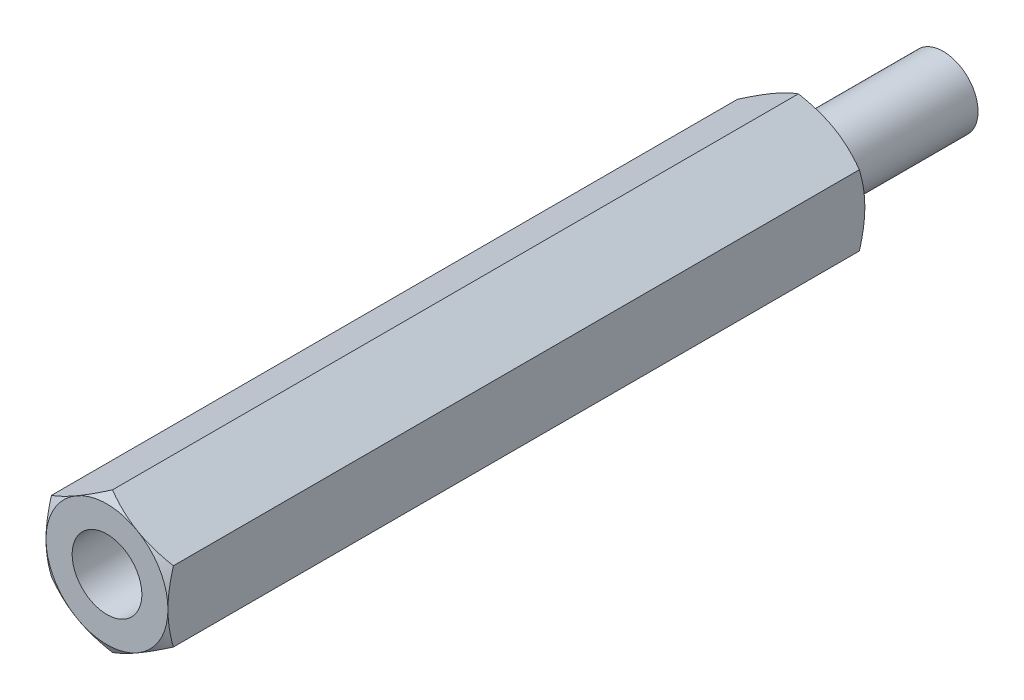
ISO-10303-21;
HEADER;
FILE_DESCRIPTION(('STEP AP214'),'2;1');
FILE_NAME('part.step','',(''),(''),'','','');
FILE_SCHEMA(('AUTOMOTIVE_DESIGN { 1 0 10303 214 1 1 1 1 }'));
ENDSEC;
DATA;
#1=APPLICATION_CONTEXT('core data for automotive mechanical design processes');
#2=APPLICATION_PROTOCOL_DEFINITION('international standard','automotive_design',2000,#1);
#3=PRODUCT_CONTEXT('',#1,'mechanical');
#4=PRODUCT('Part','Part','',(#3));
#5=PRODUCT_RELATED_PRODUCT_CATEGORY('part','',(#4));
#6=PRODUCT_DEFINITION_FORMATION('','',#4);
#7=PRODUCT_DEFINITION_CONTEXT('part definition',#1,'design');
#8=PRODUCT_DEFINITION('design','',#6,#7);
#9=PRODUCT_DEFINITION_SHAPE('','',#8);
#10=(LENGTH_UNIT() NAMED_UNIT(*) SI_UNIT(.MILLI.,.METRE.));
#11=(NAMED_UNIT(*) PLANE_ANGLE_UNIT() SI_UNIT($,.RADIAN.));
#12=(NAMED_UNIT(*) SI_UNIT($,.STERADIAN.) SOLID_ANGLE_UNIT());
#13=UNCERTAINTY_MEASURE_WITH_UNIT(LENGTH_MEASURE(1.E-05),#10,'distance_accuracy_value','');
#14=(GEOMETRIC_REPRESENTATION_CONTEXT(3) GLOBAL_UNCERTAINTY_ASSIGNED_CONTEXT((#13)) GLOBAL_UNIT_ASSIGNED_CONTEXT((#10,
#11,#12)) REPRESENTATION_CONTEXT('',''));
#15=CARTESIAN_POINT('',(0.,0.,0.));
#16=DIRECTION('',(0.,0.,1.));
#17=DIRECTION('',(1.,0.,0.));
#18=AXIS2_PLACEMENT_3D('',#15,#16,#17);
#19=CARTESIAN_POINT('',(0.,0.,20.));
#20=DIRECTION('',(0.,0.,1.));
#21=DIRECTION('',(1.,0.,0.));
#22=AXIS2_PLACEMENT_3D('',#19,#20,#21);
#23=PLANE('',#22);
#24=CARTESIAN_POINT('',(0.,0.,20.));
#25=DIRECTION('',(0.,0.,-1.));
#26=DIRECTION('',(1.,0.,0.));
#27=AXIS2_PLACEMENT_3D('',#24,#25,#26);
#28=CIRCLE('',#27,2.);
#29=CARTESIAN_POINT('',(-2.,0.,20.));
#30=VERTEX_POINT('',#29);
#31=EDGE_CURVE('P0_E206',#30,#30,#28,.T.);
#32=ORIENTED_EDGE('',*,*,#31,.T.);
#33=EDGE_LOOP('',(#32));
#34=FACE_BOUND('',#33,.T.);
#35=CARTESIAN_POINT('',(0.,0.,20.));
#36=DIRECTION('',(0.,0.,1.));
#37=DIRECTION('',(0.,1.,0.));
#38=AXIS2_PLACEMENT_3D('',#35,#36,#37);
#39=CIRCLE('',#38,3.5);
#40=CARTESIAN_POINT('',(1.75,3.03108891324554,20.));
#41=VERTEX_POINT('',#40);
#42=CARTESIAN_POINT('',(-1.75,3.03108891324553,20.));
#43=VERTEX_POINT('',#42);
#44=EDGE_CURVE('P0_E201',#41,#43,#39,.T.);
#45=ORIENTED_EDGE('',*,*,#44,.T.);
#46=CARTESIAN_POINT('',(0.,0.,20.));
#47=DIRECTION('',(0.,0.,1.));
#48=DIRECTION('',(0.,1.,0.));
#49=AXIS2_PLACEMENT_3D('',#46,#47,#48);
#50=CIRCLE('',#49,3.5);
#51=CARTESIAN_POINT('',(-3.5,0.,20.));
#52=VERTEX_POINT('',#51);
#53=EDGE_CURVE('P0_E210',#43,#52,#50,.T.);
#54=ORIENTED_EDGE('',*,*,#53,.T.);
#55=CARTESIAN_POINT('',(0.,0.,20.));
#56=DIRECTION('',(0.,0.,1.));
#57=DIRECTION('',(0.,1.,0.));
#58=AXIS2_PLACEMENT_3D('',#55,#56,#57);
#59=CIRCLE('',#58,3.5);
#60=CARTESIAN_POINT('',(-1.75,-3.03108891324554,20.));
#61=VERTEX_POINT('',#60);
#62=EDGE_CURVE('P0_E421',#52,#61,#59,.T.);
#63=ORIENTED_EDGE('',*,*,#62,.T.);
#64=CARTESIAN_POINT('',(0.,0.,20.));
#65=DIRECTION('',(0.,0.,1.));
#66=DIRECTION('',(0.,1.,0.));
#67=AXIS2_PLACEMENT_3D('',#64,#65,#66);
#68=CIRCLE('',#67,3.5);
#69=CARTESIAN_POINT('',(1.75,-3.03108891324553,20.));
#70=VERTEX_POINT('',#69);
#71=EDGE_CURVE('P0_E415',#61,#70,#68,.T.);
#72=ORIENTED_EDGE('',*,*,#71,.T.);
#73=CARTESIAN_POINT('',(0.,0.,20.));
#74=DIRECTION('',(0.,0.,1.));
#75=DIRECTION('',(0.,1.,0.));
#76=AXIS2_PLACEMENT_3D('',#73,#74,#75);
#77=CIRCLE('',#76,3.5);
#78=CARTESIAN_POINT('',(3.5,0.,20.));
#79=VERTEX_POINT('',#78);
#80=EDGE_CURVE('P0_E194',#70,#79,#77,.T.);
#81=ORIENTED_EDGE('',*,*,#80,.T.);
#82=CARTESIAN_POINT('',(0.,0.,20.));
#83=DIRECTION('',(0.,0.,1.));
#84=DIRECTION('',(0.,1.,0.));
#85=AXIS2_PLACEMENT_3D('',#82,#83,#84);
#86=CIRCLE('',#85,3.5);
#87=EDGE_CURVE('P0_E203',#79,#41,#86,.T.);
#88=ORIENTED_EDGE('',*,*,#87,.T.);
#89=EDGE_LOOP('',(#45,#54,#63,#72,#81,#88));
#90=FACE_BOUND('',#89,.T.);
#91=ADVANCED_FACE('P0_F17',(#34,#90),#23,.T.);
#92=CARTESIAN_POINT('',(-3.5,-2.02072594216369,0.));
#93=DIRECTION('',(-0.5,-0.866025403784439,0.));
#94=DIRECTION('',(-0.866025403784439,0.5,0.));
#95=AXIS2_PLACEMENT_3D('',#92,#93,#94);
#96=PLANE('',#95);
#97=CARTESIAN_POINT('',(-1.75,-3.03108891324553,-20.));
#98=CARTESIAN_POINT('',(-2.56217782649107,-2.56217782649107,-20.));
#99=CARTESIAN_POINT('',(-3.5,-2.02072594216369,-19.6873926088304));
#100=(BOUNDED_CURVE() B_SPLINE_CURVE(2,(#97,#98,#99),.UNSPECIFIED.,.F.,
.F.) B_SPLINE_CURVE_WITH_KNOTS((3,3),(1.03064785223055,1.34912453668423),
.UNSPECIFIED.) CURVE() GEOMETRIC_REPRESENTATION_ITEM() RATIONAL_B_SPLINE_CURVE((1.,
1.12214587875236,1.16880406420474)) REPRESENTATION_ITEM(''));
#101=CARTESIAN_POINT('',(-1.75,-3.03108891324554,-20.));
#102=VERTEX_POINT('',#101);
#103=CARTESIAN_POINT('',(-3.5,-2.02072594216369,-19.6873926088304));
#104=VERTEX_POINT('',#103);
#105=EDGE_CURVE('P0_E319',#102,#104,#100,.T.);
#106=ORIENTED_EDGE('',*,*,#105,.F.);
#107=CARTESIAN_POINT('',(0.,-4.04145188432738,-19.6873926088304));
#108=CARTESIAN_POINT('',(-0.93782217350893,-3.5,-20.));
#109=CARTESIAN_POINT('',(-1.75,-3.03108891324553,-20.));
#110=(BOUNDED_CURVE() B_SPLINE_CURVE(2,(#107,#108,#109),.UNSPECIFIED.,.F.,
.F.) B_SPLINE_CURVE_WITH_KNOTS((3,3),(0.738158892315948,1.06042130599399),
.UNSPECIFIED.) CURVE() GEOMETRIC_REPRESENTATION_ITEM() RATIONAL_B_SPLINE_CURVE((1.17255857963455,
1.12394675203494,1.)) REPRESENTATION_ITEM(''));
#111=CARTESIAN_POINT('',(0.,-4.04145188432738,-19.6873926088304));
#112=VERTEX_POINT('',#111);
#113=EDGE_CURVE('P0_E327',#112,#102,#110,.T.);
#114=ORIENTED_EDGE('',*,*,#113,.F.);
#115=DIRECTION('',(0.,0.,1.));
#116=VECTOR('',#115,1.);
#117=CARTESIAN_POINT('',(0.,-4.04145188432738,0.));
#118=LINE('',#117,#116);
#119=CARTESIAN_POINT('',(0.,-4.04145188432738,19.6873926088304));
#120=VERTEX_POINT('',#119);
#121=EDGE_CURVE('P0_E365',#112,#120,#118,.T.);
#122=ORIENTED_EDGE('',*,*,#121,.T.);
#123=CARTESIAN_POINT('',(0.,-4.04145188432738,19.6873926088304));
#124=CARTESIAN_POINT('',(-0.937822173506976,-3.50000000000113,19.9999999999989));
#125=CARTESIAN_POINT('',(-1.75,-3.03108891324553,20.));
#126=(BOUNDED_CURVE() B_SPLINE_CURVE(2,(#123,#124,#125),.UNSPECIFIED.,.F.,
.F.) B_SPLINE_CURVE_WITH_KNOTS((3,3),(0.921914113497757,1.27000474298252),
.UNSPECIFIED.) CURVE() GEOMETRIC_REPRESENTATION_ITEM() RATIONAL_B_SPLINE_CURVE((1.19657732070712,
1.13539988487303,1.)) REPRESENTATION_ITEM(''));
#127=EDGE_CURVE('P0_E199',#120,#61,#126,.T.);
#128=ORIENTED_EDGE('',*,*,#127,.T.);
#129=CARTESIAN_POINT('',(-1.75,-3.03108891324553,20.));
#130=CARTESIAN_POINT('',(-2.56217782649303,-2.56217782648994,19.9999999999989));
#131=CARTESIAN_POINT('',(-3.5,-2.02072594216369,19.6873926088304));
#132=(BOUNDED_CURVE() B_SPLINE_CURVE(2,(#129,#130,#131),.UNSPECIFIED.,.F.,
.F.) B_SPLINE_CURVE_WITH_KNOTS((3,3),(1.27000474298252,1.61809537246729),
.UNSPECIFIED.) CURVE() GEOMETRIC_REPRESENTATION_ITEM() RATIONAL_B_SPLINE_CURVE((1.,
1.13539988487303,1.19657732070712)) REPRESENTATION_ITEM(''));
#133=CARTESIAN_POINT('',(-3.5,-2.02072594216369,19.6873926088304));
#134=VERTEX_POINT('',#133);
#135=EDGE_CURVE('P0_E416',#61,#134,#132,.T.);
#136=ORIENTED_EDGE('',*,*,#135,.T.);
#137=DIRECTION('',(0.,0.,1.));
#138=VECTOR('',#137,1.);
#139=CARTESIAN_POINT('',(-3.5,-2.02072594216369,0.));
#140=LINE('',#139,#138);
#141=EDGE_CURVE('P0_E213',#104,#134,#140,.T.);
#142=ORIENTED_EDGE('',*,*,#141,.F.);
#143=EDGE_LOOP('',(#106,#114,#122,#128,#136,#142));
#144=FACE_BOUND('',#143,.T.);
#145=ADVANCED_FACE('P0_F448',(#144),#96,.T.);
#146=CARTESIAN_POINT('',(0.,0.,10.));
#147=DIRECTION('',(0.,0.,1.));
#148=DIRECTION('',(1.,0.,0.));
#149=AXIS2_PLACEMENT_3D('',#146,#147,#148);
#150=PLANE('',#149);
#151=CARTESIAN_POINT('',(0.,0.,10.));
#152=DIRECTION('',(0.,0.,-1.));
#153=DIRECTION('',(1.,0.,0.));
#154=AXIS2_PLACEMENT_3D('',#151,#152,#153);
#155=CIRCLE('',#154,2.);
#156=CARTESIAN_POINT('',(-2.,0.,10.));
#157=VERTEX_POINT('',#156);
#158=EDGE_CURVE('P0_E11',#157,#157,#155,.T.);
#159=ORIENTED_EDGE('',*,*,#158,.F.);
#160=EDGE_LOOP('',(#159));
#161=FACE_BOUND('',#160,.T.);
#162=ADVANCED_FACE('P0_F438',(#161),#150,.T.);
#163=CARTESIAN_POINT('',(0.,0.,20.));
#164=DIRECTION('',(0.,0.,-1.));
#165=DIRECTION('',(1.,0.,0.));
#166=AXIS2_PLACEMENT_3D('',#163,#164,#165);
#167=CYLINDRICAL_SURFACE('',#166,2.);
#168=ORIENTED_EDGE('',*,*,#31,.F.);
#169=DIRECTION('',(0.,0.,-1.));
#170=VECTOR('',#169,1.);
#171=CARTESIAN_POINT('',(-2.,0.,20.));
#172=LINE('',#171,#170);
#173=EDGE_CURVE('P0_E20',#30,#157,#172,.T.);
#174=ORIENTED_EDGE('',*,*,#173,.T.);
#175=ORIENTED_EDGE('',*,*,#158,.T.);
#176=ORIENTED_EDGE('',*,*,#173,.F.);
#177=EDGE_LOOP('',(#168,#174,#175,#176));
#178=FACE_BOUND('',#177,.T.);
#179=ADVANCED_FACE('P0_F436',(#178),#167,.F.);
#180=CARTESIAN_POINT('',(0.,0.,17.5103629710818));
#181=DIRECTION('',(0.,0.,-1.));
#182=DIRECTION('',(0.,1.,0.));
#183=AXIS2_PLACEMENT_3D('',#180,#181,#182);
#184=CONICAL_SURFACE('',#183,7.81217782649107,1.0471975511966);
#185=CARTESIAN_POINT('',(-1.75,3.03108891324554,20.));
#186=CARTESIAN_POINT('',(-0.937822173506975,3.50000000000113,19.9999999999989));
#187=CARTESIAN_POINT('',(0.,4.04145188432738,19.6873926088304));
#188=(BOUNDED_CURVE() B_SPLINE_CURVE(2,(#185,#186,#187),.UNSPECIFIED.,.F.,
.F.) B_SPLINE_CURVE_WITH_KNOTS((3,3),(1.27000474298252,1.61809537246729),
.UNSPECIFIED.) CURVE() GEOMETRIC_REPRESENTATION_ITEM() RATIONAL_B_SPLINE_CURVE((1.,
1.13539988487303,1.19657732070712)) REPRESENTATION_ITEM(''));
#189=CARTESIAN_POINT('',(0.,4.04145188432738,19.6873926088304));
#190=VERTEX_POINT('',#189);
#191=EDGE_CURVE('P0_E238',#43,#190,#188,.T.);
#192=ORIENTED_EDGE('',*,*,#191,.F.);
#193=ORIENTED_EDGE('',*,*,#44,.F.);
#194=CARTESIAN_POINT('',(0.,4.04145188432738,19.6873926088304));
#195=CARTESIAN_POINT('',(0.937822173506976,3.50000000000113,19.9999999999989));
#196=CARTESIAN_POINT('',(1.75,3.03108891324553,20.));
#197=(BOUNDED_CURVE() B_SPLINE_CURVE(2,(#194,#195,#196),.UNSPECIFIED.,.F.,
.F.) B_SPLINE_CURVE_WITH_KNOTS((3,3),(0.921914113497757,1.27000474298252),
.UNSPECIFIED.) CURVE() GEOMETRIC_REPRESENTATION_ITEM() RATIONAL_B_SPLINE_CURVE((1.19657732070712,
1.13539988487303,1.)) REPRESENTATION_ITEM(''));
#198=EDGE_CURVE('P0_E287',#190,#41,#197,.T.);
#199=ORIENTED_EDGE('',*,*,#198,.F.);
#200=EDGE_LOOP('',(#192,#193,#199));
#201=FACE_BOUND('',#200,.T.);
#202=ADVANCED_FACE('P0_F437',(#201),#184,.T.);
#203=CARTESIAN_POINT('',(0.,0.,17.5103629710818));
#204=DIRECTION('',(0.,0.,-1.));
#205=DIRECTION('',(0.,1.,0.));
#206=AXIS2_PLACEMENT_3D('',#203,#204,#205);
#207=CONICAL_SURFACE('',#206,7.81217782649107,1.0471975511966);
#208=CARTESIAN_POINT('',(-3.5,0.,20.));
#209=CARTESIAN_POINT('',(-3.5,0.937822173511186,19.9999999999989));
#210=CARTESIAN_POINT('',(-3.5,2.02072594216369,19.6873926088304));
#211=(BOUNDED_CURVE() B_SPLINE_CURVE(2,(#208,#209,#210),.UNSPECIFIED.,.F.,
.F.) B_SPLINE_CURVE_WITH_KNOTS((3,3),(1.27000474298252,1.61809537246729),
.UNSPECIFIED.) CURVE() GEOMETRIC_REPRESENTATION_ITEM() RATIONAL_B_SPLINE_CURVE((1.,
1.13539988487303,1.19657732070712)) REPRESENTATION_ITEM(''));
#212=CARTESIAN_POINT('',(-3.5,2.02072594216369,19.6873926088304));
#213=VERTEX_POINT('',#212);
#214=EDGE_CURVE('P0_E281',#52,#213,#211,.T.);
#215=ORIENTED_EDGE('',*,*,#214,.F.);
#216=ORIENTED_EDGE('',*,*,#53,.F.);
#217=CARTESIAN_POINT('',(-3.5,2.02072594216369,19.6873926088304));
#218=CARTESIAN_POINT('',(-2.56217782649303,2.56217782648994,19.9999999999989));
#219=CARTESIAN_POINT('',(-1.75,3.03108891324554,20.));
#220=(BOUNDED_CURVE() B_SPLINE_CURVE(2,(#217,#218,#219),.UNSPECIFIED.,.F.,
.F.) B_SPLINE_CURVE_WITH_KNOTS((3,3),(0.921914113497758,1.27000474298252),
.UNSPECIFIED.) CURVE() GEOMETRIC_REPRESENTATION_ITEM() RATIONAL_B_SPLINE_CURVE((1.19657732070712,
1.13539988487303,1.)) REPRESENTATION_ITEM(''));
#221=EDGE_CURVE('P0_E207',#213,#43,#220,.T.);
#222=ORIENTED_EDGE('',*,*,#221,.F.);
#223=EDGE_LOOP('',(#215,#216,#222));
#224=FACE_BOUND('',#223,.T.);
#225=ADVANCED_FACE('P0_F446',(#224),#207,.T.);
#226=CARTESIAN_POINT('',(0.,0.,17.5103629710818));
#227=DIRECTION('',(0.,0.,-1.));
#228=DIRECTION('',(0.,1.,0.));
#229=AXIS2_PLACEMENT_3D('',#226,#227,#228);
#230=CONICAL_SURFACE('',#229,7.81217782649107,1.0471975511966);
#231=ORIENTED_EDGE('',*,*,#135,.F.);
#232=ORIENTED_EDGE('',*,*,#62,.F.);
#233=CARTESIAN_POINT('',(-3.5,-2.02072594216369,19.6873926088304));
#234=CARTESIAN_POINT('',(-3.5,-0.937822173511202,19.9999999999989));
#235=CARTESIAN_POINT('',(-3.5,0.,20.));
#236=(BOUNDED_CURVE() B_SPLINE_CURVE(2,(#233,#234,#235),.UNSPECIFIED.,.F.,
.F.) B_SPLINE_CURVE_WITH_KNOTS((3,3),(0.921914113497763,1.27000474298252),
.UNSPECIFIED.) CURVE() GEOMETRIC_REPRESENTATION_ITEM() RATIONAL_B_SPLINE_CURVE((1.19657732070712,
1.13539988487303,1.)) REPRESENTATION_ITEM(''));
#237=EDGE_CURVE('P0_E218',#134,#52,#236,.T.);
#238=ORIENTED_EDGE('',*,*,#237,.F.);
#239=EDGE_LOOP('',(#231,#232,#238));
#240=FACE_BOUND('',#239,.T.);
#241=ADVANCED_FACE('P0_F471',(#240),#230,.T.);
#242=CARTESIAN_POINT('',(0.,0.,17.5103629710818));
#243=DIRECTION('',(0.,0.,-1.));
#244=DIRECTION('',(0.,-1.,0.));
#245=AXIS2_PLACEMENT_3D('',#242,#243,#244);
#246=CONICAL_SURFACE('',#245,7.81217782649107,1.0471975511966);
#247=ORIENTED_EDGE('',*,*,#127,.F.);
#248=CARTESIAN_POINT('',(1.75,-3.03108891324554,20.));
#249=CARTESIAN_POINT('',(0.937822173506975,-3.50000000000113,19.9999999999989));
#250=CARTESIAN_POINT('',(0.,-4.04145188432738,19.6873926088304));
#251=(BOUNDED_CURVE() B_SPLINE_CURVE(2,(#248,#249,#250),.UNSPECIFIED.,.F.,
.F.) B_SPLINE_CURVE_WITH_KNOTS((3,3),(1.27000474298252,1.61809537246729),
.UNSPECIFIED.) CURVE() GEOMETRIC_REPRESENTATION_ITEM() RATIONAL_B_SPLINE_CURVE((1.,
1.13539988487303,1.19657732070712)) REPRESENTATION_ITEM(''));
#252=EDGE_CURVE('P0_E229',#70,#120,#251,.T.);
#253=ORIENTED_EDGE('',*,*,#252,.F.);
#254=ORIENTED_EDGE('',*,*,#71,.F.);
#255=EDGE_LOOP('',(#247,#253,#254));
#256=FACE_BOUND('',#255,.T.);
#257=ADVANCED_FACE('P0_F483',(#256),#246,.T.);
#258=CARTESIAN_POINT('',(0.,0.,17.5103629710818));
#259=DIRECTION('',(0.,0.,-1.));
#260=DIRECTION('',(0.,1.,0.));
#261=AXIS2_PLACEMENT_3D('',#258,#259,#260);
#262=CONICAL_SURFACE('',#261,7.81217782649107,1.0471975511966);
#263=CARTESIAN_POINT('',(3.5,-2.02072594216369,19.6873926088304));
#264=CARTESIAN_POINT('',(2.56217782649303,-2.56217782648994,19.9999999999989));
#265=CARTESIAN_POINT('',(1.75,-3.03108891324554,20.));
#266=(BOUNDED_CURVE() B_SPLINE_CURVE(2,(#263,#264,#265),.UNSPECIFIED.,.F.,
.F.) B_SPLINE_CURVE_WITH_KNOTS((3,3),(0.921914113497758,1.27000474298252),
.UNSPECIFIED.) CURVE() GEOMETRIC_REPRESENTATION_ITEM() RATIONAL_B_SPLINE_CURVE((1.19657732070712,
1.13539988487303,1.)) REPRESENTATION_ITEM(''));
#267=CARTESIAN_POINT('',(3.5,-2.02072594216369,19.6873926088304));
#268=VERTEX_POINT('',#267);
#269=EDGE_CURVE('P0_E225',#268,#70,#266,.T.);
#270=ORIENTED_EDGE('',*,*,#269,.F.);
#271=CARTESIAN_POINT('',(3.5,0.,20.));
#272=CARTESIAN_POINT('',(3.5,-0.937822173511186,19.9999999999989));
#273=CARTESIAN_POINT('',(3.5,-2.02072594216369,19.6873926088304));
#274=(BOUNDED_CURVE() B_SPLINE_CURVE(2,(#271,#272,#273),.UNSPECIFIED.,.F.,
.F.) B_SPLINE_CURVE_WITH_KNOTS((3,3),(1.27000474298252,1.61809537246729),
.UNSPECIFIED.) CURVE() GEOMETRIC_REPRESENTATION_ITEM() RATIONAL_B_SPLINE_CURVE((1.,
1.13539988487303,1.19657732070712)) REPRESENTATION_ITEM(''));
#275=EDGE_CURVE('P0_E394',#79,#268,#274,.T.);
#276=ORIENTED_EDGE('',*,*,#275,.F.);
#277=ORIENTED_EDGE('',*,*,#80,.F.);
#278=EDGE_LOOP('',(#270,#276,#277));
#279=FACE_BOUND('',#278,.T.);
#280=ADVANCED_FACE('P0_F481',(#279),#262,.T.);
#281=CARTESIAN_POINT('',(0.,0.,17.5103629710818));
#282=DIRECTION('',(0.,0.,-1.));
#283=DIRECTION('',(0.,1.,0.));
#284=AXIS2_PLACEMENT_3D('',#281,#282,#283);
#285=CONICAL_SURFACE('',#284,7.81217782649107,1.0471975511966);
#286=CARTESIAN_POINT('',(3.5,2.02072594216369,19.6873926088304));
#287=CARTESIAN_POINT('',(3.5,0.937822173511202,19.9999999999989));
#288=CARTESIAN_POINT('',(3.5,0.,20.));
#289=(BOUNDED_CURVE() B_SPLINE_CURVE(2,(#286,#287,#288),.UNSPECIFIED.,.F.,
.F.) B_SPLINE_CURVE_WITH_KNOTS((3,3),(0.921914113497763,1.27000474298252),
.UNSPECIFIED.) CURVE() GEOMETRIC_REPRESENTATION_ITEM() RATIONAL_B_SPLINE_CURVE((1.19657732070712,
1.13539988487303,1.)) REPRESENTATION_ITEM(''));
#290=CARTESIAN_POINT('',(3.5,2.02072594216369,19.6873926088304));
#291=VERTEX_POINT('',#290);
#292=EDGE_CURVE('P0_E383',#291,#79,#289,.T.);
#293=ORIENTED_EDGE('',*,*,#292,.F.);
#294=CARTESIAN_POINT('',(1.75,3.03108891324553,20.));
#295=CARTESIAN_POINT('',(2.56217782649303,2.56217782648994,19.9999999999989));
#296=CARTESIAN_POINT('',(3.5,2.02072594216369,19.6873926088304));
#297=(BOUNDED_CURVE() B_SPLINE_CURVE(2,(#294,#295,#296),.UNSPECIFIED.,.F.,
.F.) B_SPLINE_CURVE_WITH_KNOTS((3,3),(1.27000474298252,1.61809537246729),
.UNSPECIFIED.) CURVE() GEOMETRIC_REPRESENTATION_ITEM() RATIONAL_B_SPLINE_CURVE((1.,
1.13539988487303,1.19657732070712)) REPRESENTATION_ITEM(''));
#298=EDGE_CURVE('P0_E297',#41,#291,#297,.T.);
#299=ORIENTED_EDGE('',*,*,#298,.F.);
#300=ORIENTED_EDGE('',*,*,#87,.F.);
#301=EDGE_LOOP('',(#293,#299,#300));
#302=FACE_BOUND('',#301,.T.);
#303=ADVANCED_FACE('P0_F492',(#302),#285,.T.);
#304=CARTESIAN_POINT('',(0.,0.,-17.5103629710818));
#305=DIRECTION('',(0.,0.,1.));
#306=DIRECTION('',(0.,1.,0.));
#307=AXIS2_PLACEMENT_3D('',#304,#305,#306);
#308=CONICAL_SURFACE('',#307,7.81217782649107,1.0471975511966);
#309=CARTESIAN_POINT('',(3.5,2.02072594216369,-19.6873926088304));
#310=CARTESIAN_POINT('',(3.5,0.937822173508933,-20.));
#311=CARTESIAN_POINT('',(3.5,0.,-20.));
#312=(BOUNDED_CURVE() B_SPLINE_CURVE(2,(#309,#310,#311),.UNSPECIFIED.,.F.,
.F.) B_SPLINE_CURVE_WITH_KNOTS((3,3),(0.712171167776875,1.03064785223055),
.UNSPECIFIED.) CURVE() GEOMETRIC_REPRESENTATION_ITEM() RATIONAL_B_SPLINE_CURVE((1.16880406420474,
1.12214587875236,1.)) REPRESENTATION_ITEM(''));
#313=CARTESIAN_POINT('',(3.5,2.02072594216369,-19.6873926088304));
#314=VERTEX_POINT('',#313);
#315=CARTESIAN_POINT('',(3.5,0.,-20.));
#316=VERTEX_POINT('',#315);
#317=EDGE_CURVE('P0_E374',#314,#316,#312,.T.);
#318=ORIENTED_EDGE('',*,*,#317,.T.);
#319=CARTESIAN_POINT('',(0.,0.,-20.));
#320=DIRECTION('',(0.,0.,1.));
#321=DIRECTION('',(0.,1.,0.));
#322=AXIS2_PLACEMENT_3D('',#319,#320,#321);
#323=CIRCLE('',#322,3.5);
#324=CARTESIAN_POINT('',(1.75,3.03108891324554,-20.));
#325=VERTEX_POINT('',#324);
#326=EDGE_CURVE('P0_E256',#316,#325,#323,.T.);
#327=ORIENTED_EDGE('',*,*,#326,.T.);
#328=CARTESIAN_POINT('',(1.75,3.03108891324553,-20.));
#329=CARTESIAN_POINT('',(2.56217782649107,2.56217782649107,-20.));
#330=CARTESIAN_POINT('',(3.5,2.02072594216369,-19.6873926088304));
#331=(BOUNDED_CURVE() B_SPLINE_CURVE(2,(#328,#329,#330),.UNSPECIFIED.,.F.,
.F.) B_SPLINE_CURVE_WITH_KNOTS((3,3),(1.03064785223055,1.34912453668423),
.UNSPECIFIED.) CURVE() GEOMETRIC_REPRESENTATION_ITEM() RATIONAL_B_SPLINE_CURVE((1.,
1.12214587875236,1.16880406420474)) REPRESENTATION_ITEM(''));
#332=EDGE_CURVE('P0_E314',#325,#314,#331,.T.);
#333=ORIENTED_EDGE('',*,*,#332,.T.);
#334=EDGE_LOOP('',(#318,#327,#333));
#335=FACE_BOUND('',#334,.T.);
#336=ADVANCED_FACE('P0_F500',(#335),#308,.T.);
#337=CARTESIAN_POINT('',(3.5,-2.02072594216369,0.));
#338=DIRECTION('',(1.,0.,0.));
#339=DIRECTION('',(0.,1.,0.));
#340=AXIS2_PLACEMENT_3D('',#337,#338,#339);
#341=PLANE('',#340);
#342=CARTESIAN_POINT('',(3.5,0.,-20.));
#343=CARTESIAN_POINT('',(3.5,-0.937822173508933,-20.));
#344=CARTESIAN_POINT('',(3.5,-2.02072594216369,-19.6873926088304));
#345=(BOUNDED_CURVE() B_SPLINE_CURVE(2,(#342,#343,#344),.UNSPECIFIED.,.F.,
.F.) B_SPLINE_CURVE_WITH_KNOTS((3,3),(1.03064785223055,1.34912453668423),
.UNSPECIFIED.) CURVE() GEOMETRIC_REPRESENTATION_ITEM() RATIONAL_B_SPLINE_CURVE((1.,
1.12214587875236,1.16880406420474)) REPRESENTATION_ITEM(''));
#346=CARTESIAN_POINT('',(3.5,-2.02072594216369,-19.6873926088304));
#347=VERTEX_POINT('',#346);
#348=EDGE_CURVE('P0_E371',#316,#347,#345,.T.);
#349=ORIENTED_EDGE('',*,*,#348,.F.);
#350=ORIENTED_EDGE('',*,*,#317,.F.);
#351=DIRECTION('',(0.,0.,1.));
#352=VECTOR('',#351,1.);
#353=CARTESIAN_POINT('',(3.5,2.02072594216369,0.));
#354=LINE('',#353,#352);
#355=EDGE_CURVE('P0_E307',#314,#291,#354,.T.);
#356=ORIENTED_EDGE('',*,*,#355,.T.);
#357=ORIENTED_EDGE('',*,*,#292,.T.);
#358=ORIENTED_EDGE('',*,*,#275,.T.);
#359=DIRECTION('',(0.,0.,-1.));
#360=VECTOR('',#359,1.);
#361=CARTESIAN_POINT('',(3.5,-2.02072594216369,0.));
#362=LINE('',#361,#360);
#363=EDGE_CURVE('P0_E228',#268,#347,#362,.T.);
#364=ORIENTED_EDGE('',*,*,#363,.T.);
#365=EDGE_LOOP('',(#349,#350,#356,#357,#358,#364));
#366=FACE_BOUND('',#365,.T.);
#367=ADVANCED_FACE('P0_F489',(#366),#341,.T.);
#368=CARTESIAN_POINT('',(0.,0.,-17.5103629710818));
#369=DIRECTION('',(0.,0.,1.));
#370=DIRECTION('',(0.,1.,0.));
#371=AXIS2_PLACEMENT_3D('',#368,#369,#370);
#372=CONICAL_SURFACE('',#371,7.81217782649107,1.0471975511966);
#373=CARTESIAN_POINT('',(3.5,-2.02072594216369,-19.6873926088304));
#374=CARTESIAN_POINT('',(2.56217782649107,-2.56217782649107,-20.));
#375=CARTESIAN_POINT('',(1.75,-3.03108891324554,-20.));
#376=(BOUNDED_CURVE() B_SPLINE_CURVE(2,(#373,#374,#375),.UNSPECIFIED.,.F.,
.F.) B_SPLINE_CURVE_WITH_KNOTS((3,3),(0.712171167776875,1.03064785223055),
.UNSPECIFIED.) CURVE() GEOMETRIC_REPRESENTATION_ITEM() RATIONAL_B_SPLINE_CURVE((1.16880406420474,
1.12214587875236,1.)) REPRESENTATION_ITEM(''));
#377=CARTESIAN_POINT('',(1.75,-3.03108891324553,-20.));
#378=VERTEX_POINT('',#377);
#379=EDGE_CURVE('P0_E344',#347,#378,#376,.T.);
#380=ORIENTED_EDGE('',*,*,#379,.T.);
#381=CARTESIAN_POINT('',(0.,0.,-20.));
#382=DIRECTION('',(0.,0.,1.));
#383=DIRECTION('',(0.,1.,0.));
#384=AXIS2_PLACEMENT_3D('',#381,#382,#383);
#385=CIRCLE('',#384,3.5);
#386=EDGE_CURVE('P0_E259',#378,#316,#385,.T.);
#387=ORIENTED_EDGE('',*,*,#386,.T.);
#388=ORIENTED_EDGE('',*,*,#348,.T.);
#389=EDGE_LOOP('',(#380,#387,#388));
#390=FACE_BOUND('',#389,.T.);
#391=ADVANCED_FACE('P0_F498',(#390),#372,.T.);
#392=CARTESIAN_POINT('',(0.,-4.04145188432738,0.));
#393=DIRECTION('',(0.5,-0.866025403784439,0.));
#394=DIRECTION('',(0.,0.,-1.));
#395=AXIS2_PLACEMENT_3D('',#392,#393,#394);
#396=PLANE('',#395);
#397=CARTESIAN_POINT('',(1.75,-3.03108891324554,-20.));
#398=CARTESIAN_POINT('',(0.937822173508927,-3.5,-20.));
#399=CARTESIAN_POINT('',(0.,-4.04145188432738,-19.6873926088304));
#400=(BOUNDED_CURVE() B_SPLINE_CURVE(2,(#397,#398,#399),.UNSPECIFIED.,.F.,
.F.) B_SPLINE_CURVE_WITH_KNOTS((3,3),(1.06042130599399,1.38268371967203),
.UNSPECIFIED.) CURVE() GEOMETRIC_REPRESENTATION_ITEM() RATIONAL_B_SPLINE_CURVE((1.,
1.12394675203494,1.17255857963456)) REPRESENTATION_ITEM(''));
#401=EDGE_CURVE('P0_E336',#378,#112,#400,.T.);
#402=ORIENTED_EDGE('',*,*,#401,.F.);
#403=ORIENTED_EDGE('',*,*,#379,.F.);
#404=ORIENTED_EDGE('',*,*,#363,.F.);
#405=ORIENTED_EDGE('',*,*,#269,.T.);
#406=ORIENTED_EDGE('',*,*,#252,.T.);
#407=ORIENTED_EDGE('',*,*,#121,.F.);
#408=EDGE_LOOP('',(#402,#403,#404,#405,#406,#407));
#409=FACE_BOUND('',#408,.T.);
#410=ADVANCED_FACE('P0_F486',(#409),#396,.T.);
#411=CARTESIAN_POINT('',(0.,0.,-17.5103629710818));
#412=DIRECTION('',(0.,0.,1.));
#413=DIRECTION('',(0.,-1.,0.));
#414=AXIS2_PLACEMENT_3D('',#411,#412,#413);
#415=CONICAL_SURFACE('',#414,7.81217782649107,1.0471975511966);
#416=ORIENTED_EDGE('',*,*,#113,.T.);
#417=CARTESIAN_POINT('',(0.,0.,-20.));
#418=DIRECTION('',(0.,0.,1.));
#419=DIRECTION('',(0.,1.,0.));
#420=AXIS2_PLACEMENT_3D('',#417,#418,#419);
#421=CIRCLE('',#420,3.5);
#422=EDGE_CURVE('P0_E191',#102,#378,#421,.T.);
#423=ORIENTED_EDGE('',*,*,#422,.T.);
#424=ORIENTED_EDGE('',*,*,#401,.T.);
#425=EDGE_LOOP('',(#416,#423,#424));
#426=FACE_BOUND('',#425,.T.);
#427=ADVANCED_FACE('P0_F504',(#426),#415,.T.);
#428=CARTESIAN_POINT('',(0.,0.,-17.5103629710818));
#429=DIRECTION('',(0.,0.,1.));
#430=DIRECTION('',(0.,1.,0.));
#431=AXIS2_PLACEMENT_3D('',#428,#429,#430);
#432=CONICAL_SURFACE('',#431,7.81217782649107,1.0471975511966);
#433=ORIENTED_EDGE('',*,*,#105,.T.);
#434=CARTESIAN_POINT('',(-3.5,-2.02072594216369,-19.6873926088304));
#435=CARTESIAN_POINT('',(-3.5,-0.937822173508933,-20.));
#436=CARTESIAN_POINT('',(-3.5,0.,-20.));
#437=(BOUNDED_CURVE() B_SPLINE_CURVE(2,(#434,#435,#436),.UNSPECIFIED.,.F.,
.F.) B_SPLINE_CURVE_WITH_KNOTS((3,3),(0.712171167776875,1.03064785223055),
.UNSPECIFIED.) CURVE() GEOMETRIC_REPRESENTATION_ITEM() RATIONAL_B_SPLINE_CURVE((1.16880406420474,
1.12214587875236,1.)) REPRESENTATION_ITEM(''));
#438=CARTESIAN_POINT('',(-3.5,0.,-20.));
#439=VERTEX_POINT('',#438);
#440=EDGE_CURVE('P0_E219',#104,#439,#437,.T.);
#441=ORIENTED_EDGE('',*,*,#440,.T.);
#442=CARTESIAN_POINT('',(0.,0.,-20.));
#443=DIRECTION('',(0.,0.,1.));
#444=DIRECTION('',(0.,1.,0.));
#445=AXIS2_PLACEMENT_3D('',#442,#443,#444);
#446=CIRCLE('',#445,3.5);
#447=EDGE_CURVE('P0_E151',#439,#102,#446,.T.);
#448=ORIENTED_EDGE('',*,*,#447,.T.);
#449=EDGE_LOOP('',(#433,#441,#448));
#450=FACE_BOUND('',#449,.T.);
#451=ADVANCED_FACE('P0_F506',(#450),#432,.T.);
#452=CARTESIAN_POINT('',(3.5,2.02072594216369,0.));
#453=DIRECTION('',(0.5,0.866025403784439,0.));
#454=DIRECTION('',(0.,0.,-1.));
#455=AXIS2_PLACEMENT_3D('',#452,#453,#454);
#456=PLANE('',#455);
#457=CARTESIAN_POINT('',(0.,4.04145188432738,-19.6873926088304));
#458=CARTESIAN_POINT('',(0.93782217350893,3.5,-20.));
#459=CARTESIAN_POINT('',(1.75,3.03108891324553,-20.));
#460=(BOUNDED_CURVE() B_SPLINE_CURVE(2,(#457,#458,#459),.UNSPECIFIED.,.F.,
.F.) B_SPLINE_CURVE_WITH_KNOTS((3,3),(0.738158892315948,1.06042130599399),
.UNSPECIFIED.) CURVE() GEOMETRIC_REPRESENTATION_ITEM() RATIONAL_B_SPLINE_CURVE((1.17255857963455,
1.12394675203494,1.)) REPRESENTATION_ITEM(''));
#461=CARTESIAN_POINT('',(0.,4.04145188432738,-19.6873926088304));
#462=VERTEX_POINT('',#461);
#463=EDGE_CURVE('P0_E172',#462,#325,#460,.T.);
#464=ORIENTED_EDGE('',*,*,#463,.F.);
#465=DIRECTION('',(0.,0.,1.));
#466=VECTOR('',#465,1.);
#467=CARTESIAN_POINT('',(0.,4.04145188432738,0.));
#468=LINE('',#467,#466);
#469=EDGE_CURVE('P0_E178',#462,#190,#468,.T.);
#470=ORIENTED_EDGE('',*,*,#469,.T.);
#471=ORIENTED_EDGE('',*,*,#198,.T.);
#472=ORIENTED_EDGE('',*,*,#298,.T.);
#473=ORIENTED_EDGE('',*,*,#355,.F.);
#474=ORIENTED_EDGE('',*,*,#332,.F.);
#475=EDGE_LOOP('',(#464,#470,#471,#472,#473,#474));
#476=FACE_BOUND('',#475,.T.);
#477=ADVANCED_FACE('P0_F494',(#476),#456,.T.);
#478=CARTESIAN_POINT('',(-3.5,2.02072594216369,0.));
#479=DIRECTION('',(-1.,0.,0.));
#480=DIRECTION('',(0.,0.,1.));
#481=AXIS2_PLACEMENT_3D('',#478,#479,#480);
#482=PLANE('',#481);
#483=CARTESIAN_POINT('',(-3.5,0.,-20.));
#484=CARTESIAN_POINT('',(-3.5,0.937822173508933,-20.));
#485=CARTESIAN_POINT('',(-3.5,2.02072594216369,-19.6873926088304));
#486=(BOUNDED_CURVE() B_SPLINE_CURVE(2,(#483,#484,#485),.UNSPECIFIED.,.F.,
.F.) B_SPLINE_CURVE_WITH_KNOTS((3,3),(1.03064785223055,1.34912453668423),
.UNSPECIFIED.) CURVE() GEOMETRIC_REPRESENTATION_ITEM() RATIONAL_B_SPLINE_CURVE((1.,
1.12214587875236,1.16880406420474)) REPRESENTATION_ITEM(''));
#487=CARTESIAN_POINT('',(-3.5,2.02072594216369,-19.6873926088304));
#488=VERTEX_POINT('',#487);
#489=EDGE_CURVE('P0_E152',#439,#488,#486,.T.);
#490=ORIENTED_EDGE('',*,*,#489,.F.);
#491=ORIENTED_EDGE('',*,*,#440,.F.);
#492=ORIENTED_EDGE('',*,*,#141,.T.);
#493=ORIENTED_EDGE('',*,*,#237,.T.);
#494=ORIENTED_EDGE('',*,*,#214,.T.);
#495=DIRECTION('',(0.,0.,1.));
#496=VECTOR('',#495,1.);
#497=CARTESIAN_POINT('',(-3.5,2.02072594216369,0.));
#498=LINE('',#497,#496);
#499=EDGE_CURVE('P0_E164',#488,#213,#498,.T.);
#500=ORIENTED_EDGE('',*,*,#499,.F.);
#501=EDGE_LOOP('',(#490,#491,#492,#493,#494,#500));
#502=FACE_BOUND('',#501,.T.);
#503=ADVANCED_FACE('P0_F470',(#502),#482,.T.);
#504=CARTESIAN_POINT('',(0.,0.,-17.5103629710818));
#505=DIRECTION('',(0.,0.,1.));
#506=DIRECTION('',(0.,1.,0.));
#507=AXIS2_PLACEMENT_3D('',#504,#505,#506);
#508=CONICAL_SURFACE('',#507,7.81217782649107,1.0471975511966);
#509=ORIENTED_EDGE('',*,*,#489,.T.);
#510=CARTESIAN_POINT('',(-3.5,2.02072594216369,-19.6873926088304));
#511=CARTESIAN_POINT('',(-2.56217782649107,2.56217782649107,-20.));
#512=CARTESIAN_POINT('',(-1.75,3.03108891324554,-20.));
#513=(BOUNDED_CURVE() B_SPLINE_CURVE(2,(#510,#511,#512),.UNSPECIFIED.,.F.,
.F.) B_SPLINE_CURVE_WITH_KNOTS((3,3),(0.712171167776875,1.03064785223055),
.UNSPECIFIED.) CURVE() GEOMETRIC_REPRESENTATION_ITEM() RATIONAL_B_SPLINE_CURVE((1.16880406420474,
1.12214587875236,1.)) REPRESENTATION_ITEM(''));
#514=CARTESIAN_POINT('',(-1.75,3.03108891324553,-20.));
#515=VERTEX_POINT('',#514);
#516=EDGE_CURVE('P0_E160',#488,#515,#513,.T.);
#517=ORIENTED_EDGE('',*,*,#516,.T.);
#518=CARTESIAN_POINT('',(0.,0.,-20.));
#519=DIRECTION('',(0.,0.,1.));
#520=DIRECTION('',(0.,1.,0.));
#521=AXIS2_PLACEMENT_3D('',#518,#519,#520);
#522=CIRCLE('',#521,3.5);
#523=EDGE_CURVE('P0_E142',#515,#439,#522,.T.);
#524=ORIENTED_EDGE('',*,*,#523,.T.);
#525=EDGE_LOOP('',(#509,#517,#524));
#526=FACE_BOUND('',#525,.T.);
#527=ADVANCED_FACE('P0_F158',(#526),#508,.T.);
#528=CARTESIAN_POINT('',(0.,0.,-20.));
#529=DIRECTION('',(0.,0.,-1.));
#530=DIRECTION('',(0.,-1.,0.));
#531=AXIS2_PLACEMENT_3D('',#528,#529,#530);
#532=PLANE('',#531);
#533=CARTESIAN_POINT('',(0.,0.,-20.));
#534=DIRECTION('',(0.,0.,1.));
#535=DIRECTION('',(0.,1.,0.));
#536=AXIS2_PLACEMENT_3D('',#533,#534,#535);
#537=CIRCLE('',#536,3.5);
#538=EDGE_CURVE('P0_E150',#325,#515,#537,.T.);
#539=ORIENTED_EDGE('',*,*,#538,.F.);
#540=ORIENTED_EDGE('',*,*,#326,.F.);
#541=ORIENTED_EDGE('',*,*,#386,.F.);
#542=ORIENTED_EDGE('',*,*,#422,.F.);
#543=ORIENTED_EDGE('',*,*,#447,.F.);
#544=ORIENTED_EDGE('',*,*,#523,.F.);
#545=EDGE_LOOP('',(#539,#540,#541,#542,#543,#544));
#546=FACE_BOUND('',#545,.T.);
#547=ADVANCED_FACE('P0_F145',(#546),#532,.T.);
#548=CARTESIAN_POINT('',(0.,4.04145188432738,0.));
#549=DIRECTION('',(-0.5,0.866025403784439,0.));
#550=DIRECTION('',(0.,0.,1.));
#551=AXIS2_PLACEMENT_3D('',#548,#549,#550);
#552=PLANE('',#551);
#553=CARTESIAN_POINT('',(-1.75,3.03108891324554,-20.));
#554=CARTESIAN_POINT('',(-0.93782217350893,3.5,-20.));
#555=CARTESIAN_POINT('',(0.,4.04145188432738,-19.6873926088304));
#556=(BOUNDED_CURVE() B_SPLINE_CURVE(2,(#553,#554,#555),.UNSPECIFIED.,.F.,
.F.) B_SPLINE_CURVE_WITH_KNOTS((3,3),(1.06042130599399,1.38268371967203),
.UNSPECIFIED.) CURVE() GEOMETRIC_REPRESENTATION_ITEM() RATIONAL_B_SPLINE_CURVE((1.,
1.12394675203494,1.17255857963455)) REPRESENTATION_ITEM(''));
#557=EDGE_CURVE('P0_E168',#515,#462,#556,.T.);
#558=ORIENTED_EDGE('',*,*,#557,.F.);
#559=ORIENTED_EDGE('',*,*,#516,.F.);
#560=ORIENTED_EDGE('',*,*,#499,.T.);
#561=ORIENTED_EDGE('',*,*,#221,.T.);
#562=ORIENTED_EDGE('',*,*,#191,.T.);
#563=ORIENTED_EDGE('',*,*,#469,.F.);
#564=EDGE_LOOP('',(#558,#559,#560,#561,#562,#563));
#565=FACE_BOUND('',#564,.T.);
#566=ADVANCED_FACE('P0_F175',(#565),#552,.T.);
#567=CARTESIAN_POINT('',(0.,0.,-17.5103629710818));
#568=DIRECTION('',(0.,0.,1.));
#569=DIRECTION('',(0.,1.,0.));
#570=AXIS2_PLACEMENT_3D('',#567,#568,#569);
#571=CONICAL_SURFACE('',#570,7.81217782649107,1.0471975511966);
#572=ORIENTED_EDGE('',*,*,#557,.T.);
#573=ORIENTED_EDGE('',*,*,#463,.T.);
#574=ORIENTED_EDGE('',*,*,#538,.T.);
#575=EDGE_LOOP('',(#572,#573,#574));
#576=FACE_BOUND('',#575,.T.);
#577=ADVANCED_FACE('P0_F166',(#576),#571,.T.);
#578=CLOSED_SHELL('',(#91,#145,#162,#179,#202,#225,#241,#257,#280,#303,#336,#367,#391,#410,#427,
#451,#477,#503,#527,#547,#566,#577));
#579=MANIFOLD_SOLID_BREP('P0_B1',#578);
#580=CARTESIAN_POINT('',(0.,0.,-28.));
#581=DIRECTION('',(0.,0.,1.));
#582=DIRECTION('',(1.,0.,0.));
#583=AXIS2_PLACEMENT_3D('',#580,#581,#582);
#584=PLANE('',#583);
#585=CARTESIAN_POINT('',(0.,0.,-28.));
#586=DIRECTION('',(0.,0.,-1.));
#587=DIRECTION('',(1.,0.,0.));
#588=AXIS2_PLACEMENT_3D('',#585,#586,#587);
#589=CIRCLE('',#588,2.);
#590=CARTESIAN_POINT('',(-2.,0.,-28.));
#591=VERTEX_POINT('',#590);
#592=EDGE_CURVE('P1_E45',#591,#591,#589,.T.);
#593=ORIENTED_EDGE('',*,*,#592,.T.);
#594=EDGE_LOOP('',(#593));
#595=FACE_BOUND('',#594,.T.);
#596=ADVANCED_FACE('P1_F17',(#595),#584,.F.);
#597=CARTESIAN_POINT('',(0.,0.,-20.));
#598=DIRECTION('',(0.,0.,1.));
#599=DIRECTION('',(1.,0.,0.));
#600=AXIS2_PLACEMENT_3D('',#597,#598,#599);
#601=PLANE('',#600);
#602=CARTESIAN_POINT('',(0.,0.,-20.));
#603=DIRECTION('',(0.,0.,1.));
#604=DIRECTION('',(1.,0.,0.));
#605=AXIS2_PLACEMENT_3D('',#602,#603,#604);
#606=CIRCLE('',#605,2.);
#607=CARTESIAN_POINT('',(-2.,0.,-20.));
#608=VERTEX_POINT('',#607);
#609=EDGE_CURVE('P1_E11',#608,#608,#606,.T.);
#610=ORIENTED_EDGE('',*,*,#609,.T.);
#611=EDGE_LOOP('',(#610));
#612=FACE_BOUND('',#611,.T.);
#613=ADVANCED_FACE('P1_F52',(#612),#601,.T.);
#614=CARTESIAN_POINT('',(0.,0.,-20.));
#615=DIRECTION('',(0.,0.,-1.));
#616=DIRECTION('',(1.,0.,0.));
#617=AXIS2_PLACEMENT_3D('',#614,#615,#616);
#618=CYLINDRICAL_SURFACE('',#617,2.);
#619=ORIENTED_EDGE('',*,*,#592,.F.);
#620=DIRECTION('',(0.,0.,1.));
#621=VECTOR('',#620,1.);
#622=CARTESIAN_POINT('',(-2.,0.,-20.));
#623=LINE('',#622,#621);
#624=EDGE_CURVE('P1_E25',#591,#608,#623,.T.);
#625=ORIENTED_EDGE('',*,*,#624,.T.);
#626=ORIENTED_EDGE('',*,*,#609,.F.);
#627=ORIENTED_EDGE('',*,*,#624,.F.);
#628=EDGE_LOOP('',(#619,#625,#626,#627));
#629=FACE_BOUND('',#628,.T.);
#630=ADVANCED_FACE('P1_F41',(#629),#618,.T.);
#631=CLOSED_SHELL('',(#596,#613,#630));
#632=MANIFOLD_SOLID_BREP('P1_B1',#631);
#633=ADVANCED_BREP_SHAPE_REPRESENTATION('',(#18,#579,#632),#14);
#634=SHAPE_DEFINITION_REPRESENTATION(#9,#633);
ENDSEC;
END-ISO-10303-21;
